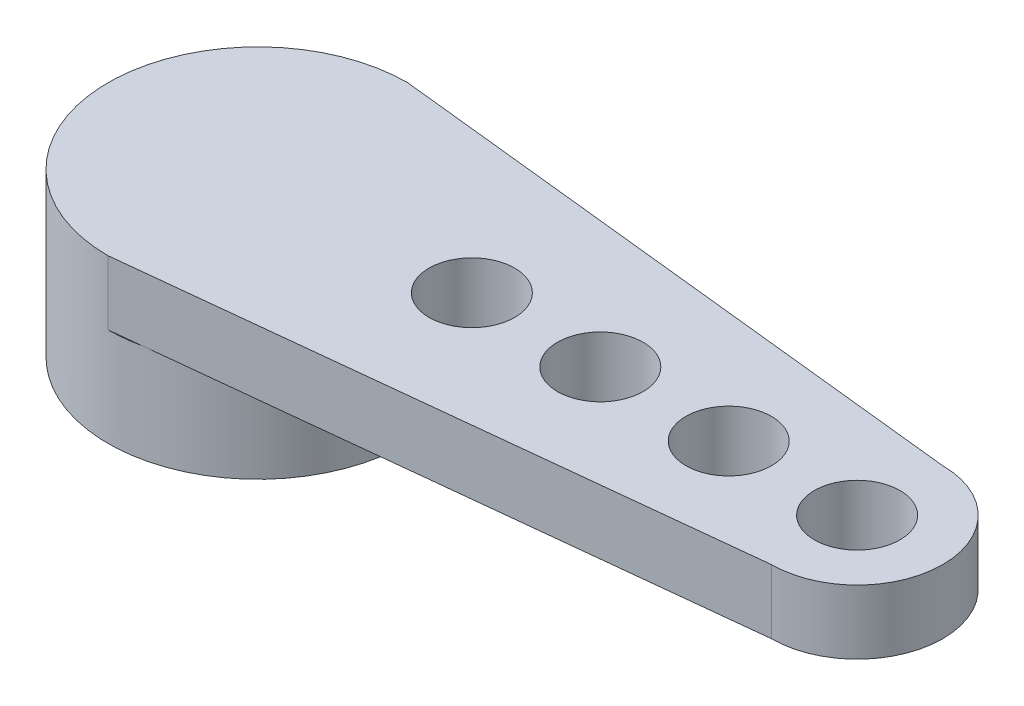
ISO-10303-21;
HEADER;
FILE_DESCRIPTION(('STEP AP214'),'2;1');
FILE_NAME('part.step','',(''),(''),'','','');
FILE_SCHEMA(('AUTOMOTIVE_DESIGN { 1 0 10303 214 1 1 1 1 }'));
ENDSEC;
DATA;
#1=APPLICATION_CONTEXT('core data for automotive mechanical design processes');
#2=APPLICATION_PROTOCOL_DEFINITION('international standard','automotive_design',2000,#1);
#3=PRODUCT_CONTEXT('',#1,'mechanical');
#4=PRODUCT('Part','Part','',(#3));
#5=PRODUCT_RELATED_PRODUCT_CATEGORY('part','',(#4));
#6=PRODUCT_DEFINITION_FORMATION('','',#4);
#7=PRODUCT_DEFINITION_CONTEXT('part definition',#1,'design');
#8=PRODUCT_DEFINITION('design','',#6,#7);
#9=PRODUCT_DEFINITION_SHAPE('','',#8);
#10=(LENGTH_UNIT() NAMED_UNIT(*) SI_UNIT(.MILLI.,.METRE.));
#11=(NAMED_UNIT(*) PLANE_ANGLE_UNIT() SI_UNIT($,.RADIAN.));
#12=(NAMED_UNIT(*) SI_UNIT($,.STERADIAN.) SOLID_ANGLE_UNIT());
#13=UNCERTAINTY_MEASURE_WITH_UNIT(LENGTH_MEASURE(1.E-05),#10,'distance_accuracy_value','');
#14=(GEOMETRIC_REPRESENTATION_CONTEXT(3) GLOBAL_UNCERTAINTY_ASSIGNED_CONTEXT((#13)) GLOBAL_UNIT_ASSIGNED_CONTEXT((#10,
#11,#12)) REPRESENTATION_CONTEXT('',''));
#15=CARTESIAN_POINT('',(0.,0.,0.));
#16=DIRECTION('',(0.,0.,1.));
#17=DIRECTION('',(1.,0.,0.));
#18=AXIS2_PLACEMENT_3D('',#15,#16,#17);
#19=CARTESIAN_POINT('',(0.,1.5,0.));
#20=DIRECTION('',(0.,-1.,0.));
#21=DIRECTION('',(0.,0.,-1.));
#22=AXIS2_PLACEMENT_3D('',#19,#20,#21);
#23=CYLINDRICAL_SURFACE('',#22,3.5);
#24=DIRECTION('',(0.,-1.,0.));
#25=VECTOR('',#24,1.);
#26=CARTESIAN_POINT('',(0.,1.5,-3.5));
#27=LINE('',#26,#25);
#28=CARTESIAN_POINT('',(0.,1.5,-3.5));
#29=VERTEX_POINT('',#28);
#30=CARTESIAN_POINT('',(0.,0.,-3.5));
#31=VERTEX_POINT('',#30);
#32=EDGE_CURVE('E105',#29,#31,#27,.T.);
#33=ORIENTED_EDGE('',*,*,#32,.T.);
#34=CARTESIAN_POINT('',(0.,0.,0.));
#35=DIRECTION('',(0.,-1.,0.));
#36=DIRECTION('',(0.,0.,-1.));
#37=AXIS2_PLACEMENT_3D('',#34,#35,#36);
#38=CIRCLE('',#37,3.5);
#39=CARTESIAN_POINT('',(0.741488020176543,0.,-3.42055485498108));
#40=VERTEX_POINT('',#39);
#41=EDGE_CURVE('E47',#31,#40,#38,.T.);
#42=ORIENTED_EDGE('',*,*,#41,.T.);
#43=CARTESIAN_POINT('',(0.741488020176543,0.,3.42055485498108));
#44=VERTEX_POINT('',#43);
#45=EDGE_CURVE('E11',#40,#44,#38,.T.);
#46=ORIENTED_EDGE('',*,*,#45,.T.);
#47=CARTESIAN_POINT('',(0.,0.,3.5));
#48=VERTEX_POINT('',#47);
#49=EDGE_CURVE('E48',#44,#48,#38,.T.);
#50=ORIENTED_EDGE('',*,*,#49,.T.);
#51=DIRECTION('',(0.,-1.,0.));
#52=VECTOR('',#51,1.);
#53=CARTESIAN_POINT('',(0.,1.5,3.5));
#54=LINE('',#53,#52);
#55=CARTESIAN_POINT('',(0.,1.5,3.5));
#56=VERTEX_POINT('',#55);
#57=EDGE_CURVE('E45',#56,#48,#54,.T.);
#58=ORIENTED_EDGE('',*,*,#57,.F.);
#59=CARTESIAN_POINT('',(0.,1.5,0.));
#60=DIRECTION('',(0.,1.,0.));
#61=DIRECTION('',(0.,0.,1.));
#62=AXIS2_PLACEMENT_3D('',#59,#60,#61);
#63=CIRCLE('',#62,3.5);
#64=EDGE_CURVE('E112',#29,#56,#63,.T.);
#65=ORIENTED_EDGE('',*,*,#64,.F.);
#66=EDGE_LOOP('',(#33,#42,#46,#50,#58,#65));
#67=FACE_BOUND('',#66,.T.);
#68=CARTESIAN_POINT('',(0.,-2.3,0.));
#69=DIRECTION('',(0.,-1.,0.));
#70=DIRECTION('',(0.,0.,-1.));
#71=AXIS2_PLACEMENT_3D('',#68,#69,#70);
#72=CIRCLE('',#71,3.5);
#73=CARTESIAN_POINT('',(0.,-2.3,-3.5));
#74=VERTEX_POINT('',#73);
#75=EDGE_CURVE('E101',#74,#74,#72,.T.);
#76=ORIENTED_EDGE('',*,*,#75,.F.);
#77=EDGE_LOOP('',(#76));
#78=FACE_BOUND('',#77,.T.);
#79=ADVANCED_FACE('F36',(#67,#78),#23,.T.);
#80=CARTESIAN_POINT('',(0.,1.5,3.5));
#81=DIRECTION('',(-0.106533123634265,0.,-0.994309153919809));
#82=DIRECTION('',(-0.994309153919809,0.,0.106533123634265));
#83=AXIS2_PLACEMENT_3D('',#80,#81,#82);
#84=PLANE('',#83);
#85=DIRECTION('',(0.994309153919809,0.,-0.106533123634265));
#86=VECTOR('',#85,1.);
#87=CARTESIAN_POINT('',(0.,0.,3.5));
#88=LINE('',#87,#86);
#89=EDGE_CURVE('E151',#48,#44,#88,.T.);
#90=ORIENTED_EDGE('',*,*,#89,.T.);
#91=CARTESIAN_POINT('',(14.,0.,2.));
#92=VERTEX_POINT('',#91);
#93=EDGE_CURVE('E71',#44,#92,#88,.T.);
#94=ORIENTED_EDGE('',*,*,#93,.T.);
#95=DIRECTION('',(0.,-1.,0.));
#96=VECTOR('',#95,1.);
#97=CARTESIAN_POINT('',(14.,1.5,2.));
#98=LINE('',#97,#96);
#99=CARTESIAN_POINT('',(14.,1.5,2.));
#100=VERTEX_POINT('',#99);
#101=EDGE_CURVE('E115',#100,#92,#98,.T.);
#102=ORIENTED_EDGE('',*,*,#101,.F.);
#103=DIRECTION('',(0.994309153919809,0.,-0.106533123634265));
#104=VECTOR('',#103,1.);
#105=CARTESIAN_POINT('',(0.,1.5,3.5));
#106=LINE('',#105,#104);
#107=EDGE_CURVE('E84',#56,#100,#106,.T.);
#108=ORIENTED_EDGE('',*,*,#107,.F.);
#109=ORIENTED_EDGE('',*,*,#57,.T.);
#110=EDGE_LOOP('',(#90,#94,#102,#108,#109));
#111=FACE_BOUND('',#110,.T.);
#112=ADVANCED_FACE('F153',(#111),#84,.F.);
#113=CARTESIAN_POINT('',(14.,1.5,0.));
#114=DIRECTION('',(0.,-1.,0.));
#115=DIRECTION('',(0.,0.,-1.));
#116=AXIS2_PLACEMENT_3D('',#113,#114,#115);
#117=CYLINDRICAL_SURFACE('',#116,2.);
#118=CARTESIAN_POINT('',(14.,0.,0.));
#119=DIRECTION('',(0.,1.,0.));
#120=DIRECTION('',(0.,0.,1.));
#121=AXIS2_PLACEMENT_3D('',#118,#119,#120);
#122=CIRCLE('',#121,2.);
#123=CARTESIAN_POINT('',(14.,0.,-2.));
#124=VERTEX_POINT('',#123);
#125=EDGE_CURVE('E78',#92,#124,#122,.T.);
#126=ORIENTED_EDGE('',*,*,#125,.T.);
#127=DIRECTION('',(0.,-1.,0.));
#128=VECTOR('',#127,1.);
#129=CARTESIAN_POINT('',(14.,1.5,-2.));
#130=LINE('',#129,#128);
#131=CARTESIAN_POINT('',(14.,1.5,-2.));
#132=VERTEX_POINT('',#131);
#133=EDGE_CURVE('E113',#132,#124,#130,.T.);
#134=ORIENTED_EDGE('',*,*,#133,.F.);
#135=CARTESIAN_POINT('',(14.,1.5,0.));
#136=DIRECTION('',(0.,1.,0.));
#137=DIRECTION('',(0.,0.,1.));
#138=AXIS2_PLACEMENT_3D('',#135,#136,#137);
#139=CIRCLE('',#138,2.);
#140=EDGE_CURVE('E117',#100,#132,#139,.T.);
#141=ORIENTED_EDGE('',*,*,#140,.F.);
#142=ORIENTED_EDGE('',*,*,#101,.T.);
#143=EDGE_LOOP('',(#126,#134,#141,#142));
#144=FACE_BOUND('',#143,.T.);
#145=ADVANCED_FACE('F178',(#144),#117,.T.);
#146=CARTESIAN_POINT('',(0.,1.5,-3.5));
#147=DIRECTION('',(-0.106533123634265,0.,0.994309153919809));
#148=DIRECTION('',(0.994309153919809,0.,0.106533123634265));
#149=AXIS2_PLACEMENT_3D('',#146,#147,#148);
#150=PLANE('',#149);
#151=DIRECTION('',(-0.994309153919809,0.,-0.106533123634265));
#152=VECTOR('',#151,1.);
#153=CARTESIAN_POINT('',(0.,0.,-3.5));
#154=LINE('',#153,#152);
#155=EDGE_CURVE('E108',#124,#40,#154,.T.);
#156=ORIENTED_EDGE('',*,*,#155,.T.);
#157=EDGE_CURVE('E97',#40,#31,#154,.T.);
#158=ORIENTED_EDGE('',*,*,#157,.T.);
#159=ORIENTED_EDGE('',*,*,#32,.F.);
#160=DIRECTION('',(-0.994309153919809,0.,-0.106533123634265));
#161=VECTOR('',#160,1.);
#162=CARTESIAN_POINT('',(0.,1.5,-3.5));
#163=LINE('',#162,#161);
#164=EDGE_CURVE('E56',#132,#29,#163,.T.);
#165=ORIENTED_EDGE('',*,*,#164,.F.);
#166=ORIENTED_EDGE('',*,*,#133,.T.);
#167=EDGE_LOOP('',(#156,#158,#159,#165,#166));
#168=FACE_BOUND('',#167,.T.);
#169=ADVANCED_FACE('F104',(#168),#150,.F.);
#170=CARTESIAN_POINT('',(0.,1.5,0.));
#171=DIRECTION('',(0.,1.,0.));
#172=DIRECTION('',(0.,0.,1.));
#173=AXIS2_PLACEMENT_3D('',#170,#171,#172);
#174=PLANE('',#173);
#175=CARTESIAN_POINT('',(14.,1.5,0.));
#176=DIRECTION('',(0.,1.,0.));
#177=DIRECTION('',(0.,0.,1.));
#178=AXIS2_PLACEMENT_3D('',#175,#176,#177);
#179=CIRCLE('',#178,1.);
#180=CARTESIAN_POINT('',(14.,1.5,1.));
#181=VERTEX_POINT('',#180);
#182=EDGE_CURVE('E127',#181,#181,#179,.T.);
#183=ORIENTED_EDGE('',*,*,#182,.F.);
#184=EDGE_LOOP('',(#183));
#185=FACE_BOUND('',#184,.T.);
#186=CARTESIAN_POINT('',(11.,1.5,0.));
#187=DIRECTION('',(0.,1.,0.));
#188=DIRECTION('',(0.,0.,1.));
#189=AXIS2_PLACEMENT_3D('',#186,#187,#188);
#190=CIRCLE('',#189,1.);
#191=CARTESIAN_POINT('',(11.,1.5,1.00000000000002));
#192=VERTEX_POINT('',#191);
#193=EDGE_CURVE('E300',#192,#192,#190,.T.);
#194=ORIENTED_EDGE('',*,*,#193,.F.);
#195=EDGE_LOOP('',(#194));
#196=FACE_BOUND('',#195,.T.);
#197=CARTESIAN_POINT('',(8.,1.5,0.));
#198=DIRECTION('',(0.,1.,0.));
#199=DIRECTION('',(0.,0.,1.));
#200=AXIS2_PLACEMENT_3D('',#197,#198,#199);
#201=CIRCLE('',#200,1.);
#202=CARTESIAN_POINT('',(8.,1.5,1.00000000000004));
#203=VERTEX_POINT('',#202);
#204=EDGE_CURVE('E303',#203,#203,#201,.T.);
#205=ORIENTED_EDGE('',*,*,#204,.F.);
#206=EDGE_LOOP('',(#205));
#207=FACE_BOUND('',#206,.T.);
#208=CARTESIAN_POINT('',(5.,1.5,0.));
#209=DIRECTION('',(0.,1.,0.));
#210=DIRECTION('',(0.,0.,1.));
#211=AXIS2_PLACEMENT_3D('',#208,#209,#210);
#212=CIRCLE('',#211,1.);
#213=CARTESIAN_POINT('',(5.,1.5,1.00000000000006));
#214=VERTEX_POINT('',#213);
#215=EDGE_CURVE('E307',#214,#214,#212,.T.);
#216=ORIENTED_EDGE('',*,*,#215,.F.);
#217=EDGE_LOOP('',(#216));
#218=FACE_BOUND('',#217,.T.);
#219=ORIENTED_EDGE('',*,*,#64,.T.);
#220=ORIENTED_EDGE('',*,*,#107,.T.);
#221=ORIENTED_EDGE('',*,*,#140,.T.);
#222=ORIENTED_EDGE('',*,*,#164,.T.);
#223=EDGE_LOOP('',(#219,#220,#221,#222));
#224=FACE_BOUND('',#223,.T.);
#225=ADVANCED_FACE('F159',(#185,#196,#207,#218,#224),#174,.T.);
#226=CARTESIAN_POINT('',(0.,0.,0.));
#227=DIRECTION('',(0.,1.,0.));
#228=DIRECTION('',(0.,0.,1.));
#229=AXIS2_PLACEMENT_3D('',#226,#227,#228);
#230=PLANE('',#229);
#231=CARTESIAN_POINT('',(14.,0.,0.));
#232=DIRECTION('',(0.,1.,0.));
#233=DIRECTION('',(0.,0.,1.));
#234=AXIS2_PLACEMENT_3D('',#231,#232,#233);
#235=CIRCLE('',#234,1.);
#236=CARTESIAN_POINT('',(14.,0.,1.));
#237=VERTEX_POINT('',#236);
#238=EDGE_CURVE('E39',#237,#237,#235,.T.);
#239=ORIENTED_EDGE('',*,*,#238,.T.);
#240=EDGE_LOOP('',(#239));
#241=FACE_BOUND('',#240,.T.);
#242=CARTESIAN_POINT('',(11.,0.,0.));
#243=DIRECTION('',(0.,1.,0.));
#244=DIRECTION('',(0.,0.,1.));
#245=AXIS2_PLACEMENT_3D('',#242,#243,#244);
#246=CIRCLE('',#245,1.);
#247=CARTESIAN_POINT('',(11.,0.,1.00000000000002));
#248=VERTEX_POINT('',#247);
#249=EDGE_CURVE('E129',#248,#248,#246,.T.);
#250=ORIENTED_EDGE('',*,*,#249,.T.);
#251=EDGE_LOOP('',(#250));
#252=FACE_BOUND('',#251,.T.);
#253=CARTESIAN_POINT('',(8.,0.,0.));
#254=DIRECTION('',(0.,1.,0.));
#255=DIRECTION('',(0.,0.,1.));
#256=AXIS2_PLACEMENT_3D('',#253,#254,#255);
#257=CIRCLE('',#256,1.);
#258=CARTESIAN_POINT('',(8.,0.,1.00000000000004));
#259=VERTEX_POINT('',#258);
#260=EDGE_CURVE('E126',#259,#259,#257,.T.);
#261=ORIENTED_EDGE('',*,*,#260,.T.);
#262=EDGE_LOOP('',(#261));
#263=FACE_BOUND('',#262,.T.);
#264=CARTESIAN_POINT('',(5.,0.,0.));
#265=DIRECTION('',(0.,1.,0.));
#266=DIRECTION('',(0.,0.,1.));
#267=AXIS2_PLACEMENT_3D('',#264,#265,#266);
#268=CIRCLE('',#267,1.);
#269=CARTESIAN_POINT('',(5.,0.,1.00000000000006));
#270=VERTEX_POINT('',#269);
#271=EDGE_CURVE('E123',#270,#270,#268,.T.);
#272=ORIENTED_EDGE('',*,*,#271,.T.);
#273=EDGE_LOOP('',(#272));
#274=FACE_BOUND('',#273,.T.);
#275=ORIENTED_EDGE('',*,*,#45,.F.);
#276=ORIENTED_EDGE('',*,*,#155,.F.);
#277=ORIENTED_EDGE('',*,*,#125,.F.);
#278=ORIENTED_EDGE('',*,*,#93,.F.);
#279=EDGE_LOOP('',(#275,#276,#277,#278));
#280=FACE_BOUND('',#279,.T.);
#281=ADVANCED_FACE('F157',(#241,#252,#263,#274,#280),#230,.F.);
#282=CARTESIAN_POINT('',(0.,0.,0.));
#283=DIRECTION('',(0.,-1.,0.));
#284=DIRECTION('',(0.,0.,-1.));
#285=AXIS2_PLACEMENT_3D('',#282,#283,#284);
#286=PLANE('',#285);
#287=ORIENTED_EDGE('',*,*,#157,.F.);
#288=ORIENTED_EDGE('',*,*,#41,.F.);
#289=EDGE_LOOP('',(#287,#288));
#290=FACE_BOUND('',#289,.T.);
#291=ADVANCED_FACE('F96',(#290),#286,.F.);
#292=CARTESIAN_POINT('',(0.,-2.3,0.));
#293=DIRECTION('',(0.,-1.,0.));
#294=DIRECTION('',(0.,0.,-1.));
#295=AXIS2_PLACEMENT_3D('',#292,#293,#294);
#296=PLANE('',#295);
#297=ORIENTED_EDGE('',*,*,#75,.T.);
#298=EDGE_LOOP('',(#297));
#299=FACE_BOUND('',#298,.T.);
#300=CARTESIAN_POINT('',(0.,-2.3,0.));
#301=DIRECTION('',(0.,-1.,0.));
#302=DIRECTION('',(0.,0.,-1.));
#303=AXIS2_PLACEMENT_3D('',#300,#301,#302);
#304=CIRCLE('',#303,2.4);
#305=CARTESIAN_POINT('',(0.,-2.3,-2.4));
#306=VERTEX_POINT('',#305);
#307=EDGE_CURVE('E138',#306,#306,#304,.T.);
#308=ORIENTED_EDGE('',*,*,#307,.F.);
#309=EDGE_LOOP('',(#308));
#310=FACE_BOUND('',#309,.T.);
#311=ADVANCED_FACE('F166',(#299,#310),#296,.T.);
#312=ORIENTED_EDGE('',*,*,#89,.F.);
#313=ORIENTED_EDGE('',*,*,#49,.F.);
#314=EDGE_LOOP('',(#312,#313));
#315=FACE_BOUND('',#314,.T.);
#316=ADVANCED_FACE('F155',(#315),#286,.F.);
#317=CARTESIAN_POINT('',(0.,-2.3,0.));
#318=DIRECTION('',(0.,1.,0.));
#319=DIRECTION('',(0.,0.,1.));
#320=AXIS2_PLACEMENT_3D('',#317,#318,#319);
#321=CYLINDRICAL_SURFACE('',#320,2.4);
#322=ORIENTED_EDGE('',*,*,#307,.T.);
#323=EDGE_LOOP('',(#322));
#324=FACE_BOUND('',#323,.T.);
#325=CARTESIAN_POINT('',(0.,0.,0.));
#326=DIRECTION('',(0.,-1.,0.));
#327=DIRECTION('',(0.,0.,-1.));
#328=AXIS2_PLACEMENT_3D('',#325,#326,#327);
#329=CIRCLE('',#328,2.4);
#330=CARTESIAN_POINT('',(0.,0.,-2.4));
#331=VERTEX_POINT('',#330);
#332=EDGE_CURVE('E134',#331,#331,#329,.T.);
#333=ORIENTED_EDGE('',*,*,#332,.F.);
#334=EDGE_LOOP('',(#333));
#335=FACE_BOUND('',#334,.T.);
#336=ADVANCED_FACE('F173',(#324,#335),#321,.F.);
#337=ORIENTED_EDGE('',*,*,#332,.T.);
#338=EDGE_LOOP('',(#337));
#339=FACE_BOUND('',#338,.T.);
#340=ADVANCED_FACE('F161',(#339),#230,.F.);
#341=CARTESIAN_POINT('',(5.,-2.3,0.));
#342=DIRECTION('',(0.,1.,0.));
#343=DIRECTION('',(0.,0.,1.));
#344=AXIS2_PLACEMENT_3D('',#341,#342,#343);
#345=CYLINDRICAL_SURFACE('',#344,1.);
#346=CARTESIAN_POINT('',(5.,1.5,1.00000000000006));
#347=CARTESIAN_POINT('',(5.,1.484375,1.00000000000006));
#348=CARTESIAN_POINT('',(5.,1.46875,1.00000000000006));
#349=CARTESIAN_POINT('',(5.,1.4375,1.00000000000006));
#350=CARTESIAN_POINT('',(5.,1.421875,1.00000000000006));
#351=CARTESIAN_POINT('',(5.,1.390625,1.00000000000006));
#352=CARTESIAN_POINT('',(5.,1.375,1.00000000000006));
#353=CARTESIAN_POINT('',(5.,1.34375,1.00000000000006));
#354=CARTESIAN_POINT('',(5.,1.328125,1.00000000000006));
#355=CARTESIAN_POINT('',(5.,1.296875,1.00000000000006));
#356=CARTESIAN_POINT('',(5.,1.28125,1.00000000000006));
#357=CARTESIAN_POINT('',(5.,1.25,1.00000000000006));
#358=CARTESIAN_POINT('',(5.,1.234375,1.00000000000006));
#359=CARTESIAN_POINT('',(5.,1.203125,1.00000000000006));
#360=CARTESIAN_POINT('',(5.,1.1875,1.00000000000006));
#361=CARTESIAN_POINT('',(5.,1.15625,1.00000000000006));
#362=CARTESIAN_POINT('',(5.,1.140625,1.00000000000006));
#363=CARTESIAN_POINT('',(5.,1.109375,1.00000000000006));
#364=CARTESIAN_POINT('',(5.,1.09375,1.00000000000006));
#365=CARTESIAN_POINT('',(5.,1.0625,1.00000000000006));
#366=CARTESIAN_POINT('',(5.,1.046875,1.00000000000006));
#367=CARTESIAN_POINT('',(5.,1.015625,1.00000000000006));
#368=CARTESIAN_POINT('',(5.,1.,1.00000000000006));
#369=CARTESIAN_POINT('',(5.,0.96875,1.00000000000006));
#370=CARTESIAN_POINT('',(5.,0.953125,1.00000000000006));
#371=CARTESIAN_POINT('',(5.,0.921875,1.00000000000006));
#372=CARTESIAN_POINT('',(5.,0.90625,1.00000000000006));
#373=CARTESIAN_POINT('',(5.,0.875,1.00000000000006));
#374=CARTESIAN_POINT('',(5.,0.859375,1.00000000000006));
#375=CARTESIAN_POINT('',(5.,0.828125,1.00000000000006));
#376=CARTESIAN_POINT('',(5.,0.8125,1.00000000000006));
#377=CARTESIAN_POINT('',(5.,0.78125,1.00000000000006));
#378=CARTESIAN_POINT('',(5.,0.765625,1.00000000000006));
#379=CARTESIAN_POINT('',(5.,0.734375,1.00000000000006));
#380=CARTESIAN_POINT('',(5.,0.71875,1.00000000000006));
#381=CARTESIAN_POINT('',(5.,0.6875,1.00000000000006));
#382=CARTESIAN_POINT('',(5.,0.671875,1.00000000000006));
#383=CARTESIAN_POINT('',(5.,0.640625,1.00000000000006));
#384=CARTESIAN_POINT('',(5.,0.625,1.00000000000006));
#385=CARTESIAN_POINT('',(5.,0.59375,1.00000000000006));
#386=CARTESIAN_POINT('',(5.,0.578125,1.00000000000006));
#387=CARTESIAN_POINT('',(5.,0.546875,1.00000000000006));
#388=CARTESIAN_POINT('',(5.,0.53125,1.00000000000006));
#389=CARTESIAN_POINT('',(5.,0.5,1.00000000000006));
#390=CARTESIAN_POINT('',(5.,0.484375,1.00000000000006));
#391=CARTESIAN_POINT('',(5.,0.453125,1.00000000000006));
#392=CARTESIAN_POINT('',(5.,0.4375,1.00000000000006));
#393=CARTESIAN_POINT('',(5.,0.40625,1.00000000000006));
#394=CARTESIAN_POINT('',(5.,0.390625,1.00000000000006));
#395=CARTESIAN_POINT('',(5.,0.359375,1.00000000000006));
#396=CARTESIAN_POINT('',(5.,0.34375,1.00000000000006));
#397=CARTESIAN_POINT('',(5.,0.3125,1.00000000000006));
#398=CARTESIAN_POINT('',(5.,0.296875,1.00000000000006));
#399=CARTESIAN_POINT('',(5.,0.265625,1.00000000000006));
#400=CARTESIAN_POINT('',(5.,0.25,1.00000000000006));
#401=CARTESIAN_POINT('',(5.,0.21875,1.00000000000006));
#402=CARTESIAN_POINT('',(5.,0.203125,1.00000000000006));
#403=CARTESIAN_POINT('',(5.,0.171875,1.00000000000006));
#404=CARTESIAN_POINT('',(5.,0.15625,1.00000000000006));
#405=CARTESIAN_POINT('',(5.,0.125,1.00000000000006));
#406=CARTESIAN_POINT('',(5.,0.109375,1.00000000000006));
#407=CARTESIAN_POINT('',(5.,0.0781249999999996,1.00000000000006));
#408=CARTESIAN_POINT('',(5.,0.0624999999999996,1.00000000000006));
#409=CARTESIAN_POINT('',(5.,0.0312499999999996,1.00000000000006));
#410=CARTESIAN_POINT('',(5.,0.0156249999999996,1.00000000000006));
#411=CARTESIAN_POINT('',(5.,0.,1.00000000000006));
#412=B_SPLINE_CURVE_WITH_KNOTS('',3,(#346,#347,#348,#349,#350,#351,#352,#353,#354,#355,#356,
#357,#358,#359,#360,#361,#362,#363,#364,#365,#366,#367,#368,#369,#370,#371,#372,#373,#374,#375,
#376,#377,#378,#379,#380,#381,#382,#383,#384,#385,#386,#387,#388,#389,#390,#391,#392,#393,#394,
#395,#396,#397,#398,#399,#400,#401,#402,#403,#404,#405,#406,#407,#408,#409,#410,#411),
.UNSPECIFIED.,.F.,.F.,(4,2,2,2,2,2,2,2,2,2,2,2,2,2,2,2,2,2,2,2,2,2,2,2,2,2,2,2,2,2,2,2,4),(0.,
0.046875,0.0937500000000001,0.140625,0.1875,0.234375,0.28125,0.328125,0.375,0.421875,0.46875,
0.515625,0.5625,0.609375,0.65625,0.703125,0.75,0.796875,0.84375,0.890625,0.9375,0.984375,
1.03125,1.078125,1.125,1.171875,1.21875,1.265625,1.3125,1.359375,1.40625,1.453125,1.5),.UNSPECIFIED.);
#413=EDGE_CURVE('BSEAM172',#214,#270,#412,.T.);
#414=ORIENTED_EDGE('',*,*,#215,.T.);
#415=ORIENTED_EDGE('',*,*,#271,.F.);
#416=ORIENTED_EDGE('',*,*,#413,.T.);
#417=ORIENTED_EDGE('',*,*,#413,.F.);
#418=EDGE_LOOP('',(#414,#416,#415,#417));
#419=FACE_BOUND('',#418,.T.);
#420=ADVANCED_FACE('F172',(#419),#345,.F.);
#421=CARTESIAN_POINT('',(8.,-2.3,0.));
#422=DIRECTION('',(0.,1.,0.));
#423=DIRECTION('',(0.,0.,1.));
#424=AXIS2_PLACEMENT_3D('',#421,#422,#423);
#425=CYLINDRICAL_SURFACE('',#424,1.);
#426=CARTESIAN_POINT('',(8.,1.5,1.00000000000004));
#427=CARTESIAN_POINT('',(8.,1.484375,1.00000000000004));
#428=CARTESIAN_POINT('',(8.,1.46875,1.00000000000004));
#429=CARTESIAN_POINT('',(8.,1.4375,1.00000000000004));
#430=CARTESIAN_POINT('',(8.,1.421875,1.00000000000004));
#431=CARTESIAN_POINT('',(8.,1.390625,1.00000000000004));
#432=CARTESIAN_POINT('',(8.,1.375,1.00000000000004));
#433=CARTESIAN_POINT('',(8.,1.34375,1.00000000000004));
#434=CARTESIAN_POINT('',(8.,1.328125,1.00000000000004));
#435=CARTESIAN_POINT('',(8.,1.296875,1.00000000000004));
#436=CARTESIAN_POINT('',(8.,1.28125,1.00000000000004));
#437=CARTESIAN_POINT('',(8.,1.25,1.00000000000004));
#438=CARTESIAN_POINT('',(8.,1.234375,1.00000000000004));
#439=CARTESIAN_POINT('',(8.,1.203125,1.00000000000004));
#440=CARTESIAN_POINT('',(8.,1.1875,1.00000000000004));
#441=CARTESIAN_POINT('',(8.,1.15625,1.00000000000004));
#442=CARTESIAN_POINT('',(8.,1.140625,1.00000000000004));
#443=CARTESIAN_POINT('',(8.,1.109375,1.00000000000004));
#444=CARTESIAN_POINT('',(8.,1.09375,1.00000000000004));
#445=CARTESIAN_POINT('',(8.,1.0625,1.00000000000004));
#446=CARTESIAN_POINT('',(8.,1.046875,1.00000000000004));
#447=CARTESIAN_POINT('',(8.,1.015625,1.00000000000004));
#448=CARTESIAN_POINT('',(8.,1.,1.00000000000004));
#449=CARTESIAN_POINT('',(8.,0.96875,1.00000000000004));
#450=CARTESIAN_POINT('',(8.,0.953125,1.00000000000004));
#451=CARTESIAN_POINT('',(8.,0.921875,1.00000000000004));
#452=CARTESIAN_POINT('',(8.,0.90625,1.00000000000004));
#453=CARTESIAN_POINT('',(8.,0.875,1.00000000000004));
#454=CARTESIAN_POINT('',(8.,0.859375,1.00000000000004));
#455=CARTESIAN_POINT('',(8.,0.828125,1.00000000000004));
#456=CARTESIAN_POINT('',(8.,0.8125,1.00000000000004));
#457=CARTESIAN_POINT('',(8.,0.78125,1.00000000000004));
#458=CARTESIAN_POINT('',(8.,0.765625,1.00000000000004));
#459=CARTESIAN_POINT('',(8.,0.734375,1.00000000000004));
#460=CARTESIAN_POINT('',(8.,0.71875,1.00000000000004));
#461=CARTESIAN_POINT('',(8.,0.6875,1.00000000000004));
#462=CARTESIAN_POINT('',(8.,0.671875,1.00000000000004));
#463=CARTESIAN_POINT('',(8.,0.640625,1.00000000000004));
#464=CARTESIAN_POINT('',(8.,0.625,1.00000000000004));
#465=CARTESIAN_POINT('',(8.,0.59375,1.00000000000004));
#466=CARTESIAN_POINT('',(8.,0.578125,1.00000000000004));
#467=CARTESIAN_POINT('',(8.,0.546875,1.00000000000004));
#468=CARTESIAN_POINT('',(8.,0.53125,1.00000000000004));
#469=CARTESIAN_POINT('',(8.,0.5,1.00000000000004));
#470=CARTESIAN_POINT('',(8.,0.484375,1.00000000000004));
#471=CARTESIAN_POINT('',(8.,0.453125,1.00000000000004));
#472=CARTESIAN_POINT('',(8.,0.4375,1.00000000000004));
#473=CARTESIAN_POINT('',(8.,0.40625,1.00000000000004));
#474=CARTESIAN_POINT('',(8.,0.390625,1.00000000000004));
#475=CARTESIAN_POINT('',(8.,0.359375,1.00000000000004));
#476=CARTESIAN_POINT('',(8.,0.34375,1.00000000000004));
#477=CARTESIAN_POINT('',(8.,0.3125,1.00000000000004));
#478=CARTESIAN_POINT('',(8.,0.296875,1.00000000000004));
#479=CARTESIAN_POINT('',(8.,0.265625,1.00000000000004));
#480=CARTESIAN_POINT('',(8.,0.25,1.00000000000004));
#481=CARTESIAN_POINT('',(8.,0.21875,1.00000000000004));
#482=CARTESIAN_POINT('',(8.,0.203125,1.00000000000004));
#483=CARTESIAN_POINT('',(8.,0.171875,1.00000000000004));
#484=CARTESIAN_POINT('',(8.,0.15625,1.00000000000004));
#485=CARTESIAN_POINT('',(8.,0.125,1.00000000000004));
#486=CARTESIAN_POINT('',(8.,0.109375,1.00000000000004));
#487=CARTESIAN_POINT('',(8.,0.0781249999999996,1.00000000000004));
#488=CARTESIAN_POINT('',(8.,0.0624999999999996,1.00000000000004));
#489=CARTESIAN_POINT('',(8.,0.0312499999999996,1.00000000000004));
#490=CARTESIAN_POINT('',(8.,0.0156249999999996,1.00000000000004));
#491=CARTESIAN_POINT('',(8.,0.,1.00000000000004));
#492=B_SPLINE_CURVE_WITH_KNOTS('',3,(#426,#427,#428,#429,#430,#431,#432,#433,#434,#435,#436,
#437,#438,#439,#440,#441,#442,#443,#444,#445,#446,#447,#448,#449,#450,#451,#452,#453,#454,#455,
#456,#457,#458,#459,#460,#461,#462,#463,#464,#465,#466,#467,#468,#469,#470,#471,#472,#473,#474,
#475,#476,#477,#478,#479,#480,#481,#482,#483,#484,#485,#486,#487,#488,#489,#490,#491),
.UNSPECIFIED.,.F.,.F.,(4,2,2,2,2,2,2,2,2,2,2,2,2,2,2,2,2,2,2,2,2,2,2,2,2,2,2,2,2,2,2,2,4),(0.,
0.046875,0.0937500000000001,0.140625,0.1875,0.234375,0.28125,0.328125,0.375,0.421875,0.46875,
0.515625,0.5625,0.609375,0.65625,0.703125,0.75,0.796875,0.84375,0.890625,0.9375,0.984375,
1.03125,1.078125,1.125,1.171875,1.21875,1.265625,1.3125,1.359375,1.40625,1.453125,1.5),.UNSPECIFIED.);
#493=EDGE_CURVE('BSEAM210',#203,#259,#492,.T.);
#494=ORIENTED_EDGE('',*,*,#204,.T.);
#495=ORIENTED_EDGE('',*,*,#260,.F.);
#496=ORIENTED_EDGE('',*,*,#493,.T.);
#497=ORIENTED_EDGE('',*,*,#493,.F.);
#498=EDGE_LOOP('',(#494,#496,#495,#497));
#499=FACE_BOUND('',#498,.T.);
#500=ADVANCED_FACE('F210',(#499),#425,.F.);
#501=CARTESIAN_POINT('',(11.,-2.3,0.));
#502=DIRECTION('',(0.,1.,0.));
#503=DIRECTION('',(0.,0.,1.));
#504=AXIS2_PLACEMENT_3D('',#501,#502,#503);
#505=CYLINDRICAL_SURFACE('',#504,1.);
#506=CARTESIAN_POINT('',(11.,1.5,1.00000000000002));
#507=CARTESIAN_POINT('',(11.,1.484375,1.00000000000002));
#508=CARTESIAN_POINT('',(11.,1.46875,1.00000000000002));
#509=CARTESIAN_POINT('',(11.,1.4375,1.00000000000002));
#510=CARTESIAN_POINT('',(11.,1.421875,1.00000000000002));
#511=CARTESIAN_POINT('',(11.,1.390625,1.00000000000002));
#512=CARTESIAN_POINT('',(11.,1.375,1.00000000000002));
#513=CARTESIAN_POINT('',(11.,1.34375,1.00000000000002));
#514=CARTESIAN_POINT('',(11.,1.328125,1.00000000000002));
#515=CARTESIAN_POINT('',(11.,1.296875,1.00000000000002));
#516=CARTESIAN_POINT('',(11.,1.28125,1.00000000000002));
#517=CARTESIAN_POINT('',(11.,1.25,1.00000000000002));
#518=CARTESIAN_POINT('',(11.,1.234375,1.00000000000002));
#519=CARTESIAN_POINT('',(11.,1.203125,1.00000000000002));
#520=CARTESIAN_POINT('',(11.,1.1875,1.00000000000002));
#521=CARTESIAN_POINT('',(11.,1.15625,1.00000000000002));
#522=CARTESIAN_POINT('',(11.,1.140625,1.00000000000002));
#523=CARTESIAN_POINT('',(11.,1.109375,1.00000000000002));
#524=CARTESIAN_POINT('',(11.,1.09375,1.00000000000002));
#525=CARTESIAN_POINT('',(11.,1.0625,1.00000000000002));
#526=CARTESIAN_POINT('',(11.,1.046875,1.00000000000002));
#527=CARTESIAN_POINT('',(11.,1.015625,1.00000000000002));
#528=CARTESIAN_POINT('',(11.,1.,1.00000000000002));
#529=CARTESIAN_POINT('',(11.,0.96875,1.00000000000002));
#530=CARTESIAN_POINT('',(11.,0.953125,1.00000000000002));
#531=CARTESIAN_POINT('',(11.,0.921875,1.00000000000002));
#532=CARTESIAN_POINT('',(11.,0.90625,1.00000000000002));
#533=CARTESIAN_POINT('',(11.,0.875,1.00000000000002));
#534=CARTESIAN_POINT('',(11.,0.859375,1.00000000000002));
#535=CARTESIAN_POINT('',(11.,0.828125,1.00000000000002));
#536=CARTESIAN_POINT('',(11.,0.8125,1.00000000000002));
#537=CARTESIAN_POINT('',(11.,0.78125,1.00000000000002));
#538=CARTESIAN_POINT('',(11.,0.765625,1.00000000000002));
#539=CARTESIAN_POINT('',(11.,0.734375,1.00000000000002));
#540=CARTESIAN_POINT('',(11.,0.71875,1.00000000000002));
#541=CARTESIAN_POINT('',(11.,0.6875,1.00000000000002));
#542=CARTESIAN_POINT('',(11.,0.671875,1.00000000000002));
#543=CARTESIAN_POINT('',(11.,0.640625,1.00000000000002));
#544=CARTESIAN_POINT('',(11.,0.625,1.00000000000002));
#545=CARTESIAN_POINT('',(11.,0.59375,1.00000000000002));
#546=CARTESIAN_POINT('',(11.,0.578125,1.00000000000002));
#547=CARTESIAN_POINT('',(11.,0.546875,1.00000000000002));
#548=CARTESIAN_POINT('',(11.,0.53125,1.00000000000002));
#549=CARTESIAN_POINT('',(11.,0.5,1.00000000000002));
#550=CARTESIAN_POINT('',(11.,0.484375,1.00000000000002));
#551=CARTESIAN_POINT('',(11.,0.453125,1.00000000000002));
#552=CARTESIAN_POINT('',(11.,0.4375,1.00000000000002));
#553=CARTESIAN_POINT('',(11.,0.40625,1.00000000000002));
#554=CARTESIAN_POINT('',(11.,0.390625,1.00000000000002));
#555=CARTESIAN_POINT('',(11.,0.359375,1.00000000000002));
#556=CARTESIAN_POINT('',(11.,0.34375,1.00000000000002));
#557=CARTESIAN_POINT('',(11.,0.3125,1.00000000000002));
#558=CARTESIAN_POINT('',(11.,0.296875,1.00000000000002));
#559=CARTESIAN_POINT('',(11.,0.265625,1.00000000000002));
#560=CARTESIAN_POINT('',(11.,0.25,1.00000000000002));
#561=CARTESIAN_POINT('',(11.,0.21875,1.00000000000002));
#562=CARTESIAN_POINT('',(11.,0.203125,1.00000000000002));
#563=CARTESIAN_POINT('',(11.,0.171875,1.00000000000002));
#564=CARTESIAN_POINT('',(11.,0.15625,1.00000000000002));
#565=CARTESIAN_POINT('',(11.,0.125,1.00000000000002));
#566=CARTESIAN_POINT('',(11.,0.109375,1.00000000000002));
#567=CARTESIAN_POINT('',(11.,0.0781249999999996,1.00000000000002));
#568=CARTESIAN_POINT('',(11.,0.0624999999999996,1.00000000000002));
#569=CARTESIAN_POINT('',(11.,0.0312499999999996,1.00000000000002));
#570=CARTESIAN_POINT('',(11.,0.0156249999999996,1.00000000000002));
#571=CARTESIAN_POINT('',(11.,0.,1.00000000000002));
#572=B_SPLINE_CURVE_WITH_KNOTS('',3,(#506,#507,#508,#509,#510,#511,#512,#513,#514,#515,#516,
#517,#518,#519,#520,#521,#522,#523,#524,#525,#526,#527,#528,#529,#530,#531,#532,#533,#534,#535,
#536,#537,#538,#539,#540,#541,#542,#543,#544,#545,#546,#547,#548,#549,#550,#551,#552,#553,#554,
#555,#556,#557,#558,#559,#560,#561,#562,#563,#564,#565,#566,#567,#568,#569,#570,#571),
.UNSPECIFIED.,.F.,.F.,(4,2,2,2,2,2,2,2,2,2,2,2,2,2,2,2,2,2,2,2,2,2,2,2,2,2,2,2,2,2,2,2,4),(0.,
0.046875,0.0937500000000001,0.140625,0.1875,0.234375,0.28125,0.328125,0.375,0.421875,0.46875,
0.515625,0.5625,0.609375,0.65625,0.703125,0.75,0.796875,0.84375,0.890625,0.9375,0.984375,
1.03125,1.078125,1.125,1.171875,1.21875,1.265625,1.3125,1.359375,1.40625,1.453125,1.5),.UNSPECIFIED.);
#573=EDGE_CURVE('BSEAM221',#192,#248,#572,.T.);
#574=ORIENTED_EDGE('',*,*,#193,.T.);
#575=ORIENTED_EDGE('',*,*,#249,.F.);
#576=ORIENTED_EDGE('',*,*,#573,.T.);
#577=ORIENTED_EDGE('',*,*,#573,.F.);
#578=EDGE_LOOP('',(#574,#576,#575,#577));
#579=FACE_BOUND('',#578,.T.);
#580=ADVANCED_FACE('F221',(#579),#505,.F.);
#581=CARTESIAN_POINT('',(14.,-2.3,0.));
#582=DIRECTION('',(0.,1.,0.));
#583=DIRECTION('',(0.,0.,1.));
#584=AXIS2_PLACEMENT_3D('',#581,#582,#583);
#585=CYLINDRICAL_SURFACE('',#584,1.);
#586=CARTESIAN_POINT('',(14.,1.5,1.));
#587=CARTESIAN_POINT('',(14.,1.484375,1.));
#588=CARTESIAN_POINT('',(14.,1.46875,1.));
#589=CARTESIAN_POINT('',(14.,1.4375,1.));
#590=CARTESIAN_POINT('',(14.,1.421875,1.));
#591=CARTESIAN_POINT('',(14.,1.390625,1.));
#592=CARTESIAN_POINT('',(14.,1.375,1.));
#593=CARTESIAN_POINT('',(14.,1.34375,1.));
#594=CARTESIAN_POINT('',(14.,1.328125,1.));
#595=CARTESIAN_POINT('',(14.,1.296875,1.));
#596=CARTESIAN_POINT('',(14.,1.28125,1.));
#597=CARTESIAN_POINT('',(14.,1.25,1.));
#598=CARTESIAN_POINT('',(14.,1.234375,1.));
#599=CARTESIAN_POINT('',(14.,1.203125,1.));
#600=CARTESIAN_POINT('',(14.,1.1875,1.));
#601=CARTESIAN_POINT('',(14.,1.15625,1.));
#602=CARTESIAN_POINT('',(14.,1.140625,1.));
#603=CARTESIAN_POINT('',(14.,1.109375,1.));
#604=CARTESIAN_POINT('',(14.,1.09375,1.));
#605=CARTESIAN_POINT('',(14.,1.0625,1.));
#606=CARTESIAN_POINT('',(14.,1.046875,1.));
#607=CARTESIAN_POINT('',(14.,1.015625,1.));
#608=CARTESIAN_POINT('',(14.,1.,1.));
#609=CARTESIAN_POINT('',(14.,0.96875,1.));
#610=CARTESIAN_POINT('',(14.,0.953125,1.));
#611=CARTESIAN_POINT('',(14.,0.921875,1.));
#612=CARTESIAN_POINT('',(14.,0.90625,1.));
#613=CARTESIAN_POINT('',(14.,0.875,1.));
#614=CARTESIAN_POINT('',(14.,0.859375,1.));
#615=CARTESIAN_POINT('',(14.,0.828125,1.));
#616=CARTESIAN_POINT('',(14.,0.8125,1.));
#617=CARTESIAN_POINT('',(14.,0.78125,1.));
#618=CARTESIAN_POINT('',(14.,0.765625,1.));
#619=CARTESIAN_POINT('',(14.,0.734375,1.));
#620=CARTESIAN_POINT('',(14.,0.71875,1.));
#621=CARTESIAN_POINT('',(14.,0.6875,1.));
#622=CARTESIAN_POINT('',(14.,0.671875,1.));
#623=CARTESIAN_POINT('',(14.,0.640625,1.));
#624=CARTESIAN_POINT('',(14.,0.625,1.));
#625=CARTESIAN_POINT('',(14.,0.59375,1.));
#626=CARTESIAN_POINT('',(14.,0.578125,1.));
#627=CARTESIAN_POINT('',(14.,0.546875,1.));
#628=CARTESIAN_POINT('',(14.,0.53125,1.));
#629=CARTESIAN_POINT('',(14.,0.5,1.));
#630=CARTESIAN_POINT('',(14.,0.484375,1.));
#631=CARTESIAN_POINT('',(14.,0.453125,1.));
#632=CARTESIAN_POINT('',(14.,0.4375,1.));
#633=CARTESIAN_POINT('',(14.,0.40625,1.));
#634=CARTESIAN_POINT('',(14.,0.390625,1.));
#635=CARTESIAN_POINT('',(14.,0.359375,1.));
#636=CARTESIAN_POINT('',(14.,0.34375,1.));
#637=CARTESIAN_POINT('',(14.,0.3125,1.));
#638=CARTESIAN_POINT('',(14.,0.296875,1.));
#639=CARTESIAN_POINT('',(14.,0.265625,1.));
#640=CARTESIAN_POINT('',(14.,0.25,1.));
#641=CARTESIAN_POINT('',(14.,0.21875,1.));
#642=CARTESIAN_POINT('',(14.,0.203125,1.));
#643=CARTESIAN_POINT('',(14.,0.171875,1.));
#644=CARTESIAN_POINT('',(14.,0.15625,1.));
#645=CARTESIAN_POINT('',(14.,0.125,1.));
#646=CARTESIAN_POINT('',(14.,0.109375,1.));
#647=CARTESIAN_POINT('',(14.,0.0781249999999996,1.));
#648=CARTESIAN_POINT('',(14.,0.0624999999999996,1.));
#649=CARTESIAN_POINT('',(14.,0.0312499999999996,1.));
#650=CARTESIAN_POINT('',(14.,0.0156249999999996,1.));
#651=CARTESIAN_POINT('',(14.,0.,1.));
#652=B_SPLINE_CURVE_WITH_KNOTS('',3,(#586,#587,#588,#589,#590,#591,#592,#593,#594,#595,#596,
#597,#598,#599,#600,#601,#602,#603,#604,#605,#606,#607,#608,#609,#610,#611,#612,#613,#614,#615,
#616,#617,#618,#619,#620,#621,#622,#623,#624,#625,#626,#627,#628,#629,#630,#631,#632,#633,#634,
#635,#636,#637,#638,#639,#640,#641,#642,#643,#644,#645,#646,#647,#648,#649,#650,#651),
.UNSPECIFIED.,.F.,.F.,(4,2,2,2,2,2,2,2,2,2,2,2,2,2,2,2,2,2,2,2,2,2,2,2,2,2,2,2,2,2,2,2,4),(0.,
0.046875,0.0937500000000001,0.140625,0.1875,0.234375,0.28125,0.328125,0.375,0.421875,0.46875,
0.515625,0.5625,0.609375,0.65625,0.703125,0.75,0.796875,0.84375,0.890625,0.9375,0.984375,
1.03125,1.078125,1.125,1.171875,1.21875,1.265625,1.3125,1.359375,1.40625,1.453125,1.5),.UNSPECIFIED.);
#653=EDGE_CURVE('BSEAM231',#181,#237,#652,.T.);
#654=ORIENTED_EDGE('',*,*,#182,.T.);
#655=ORIENTED_EDGE('',*,*,#238,.F.);
#656=ORIENTED_EDGE('',*,*,#653,.T.);
#657=ORIENTED_EDGE('',*,*,#653,.F.);
#658=EDGE_LOOP('',(#654,#656,#655,#657));
#659=FACE_BOUND('',#658,.T.);
#660=ADVANCED_FACE('F231',(#659),#585,.F.);
#661=CLOSED_SHELL('',(#79,#112,#145,#169,#225,#281,#291,#311,#316,#336,#340,#420,#500,#580,#660));
#662=MANIFOLD_SOLID_BREP('B2',#661);
#663=ADVANCED_BREP_SHAPE_REPRESENTATION('',(#18,#662),#14);
#664=SHAPE_DEFINITION_REPRESENTATION(#9,#663);
ENDSEC;
END-ISO-10303-21;
